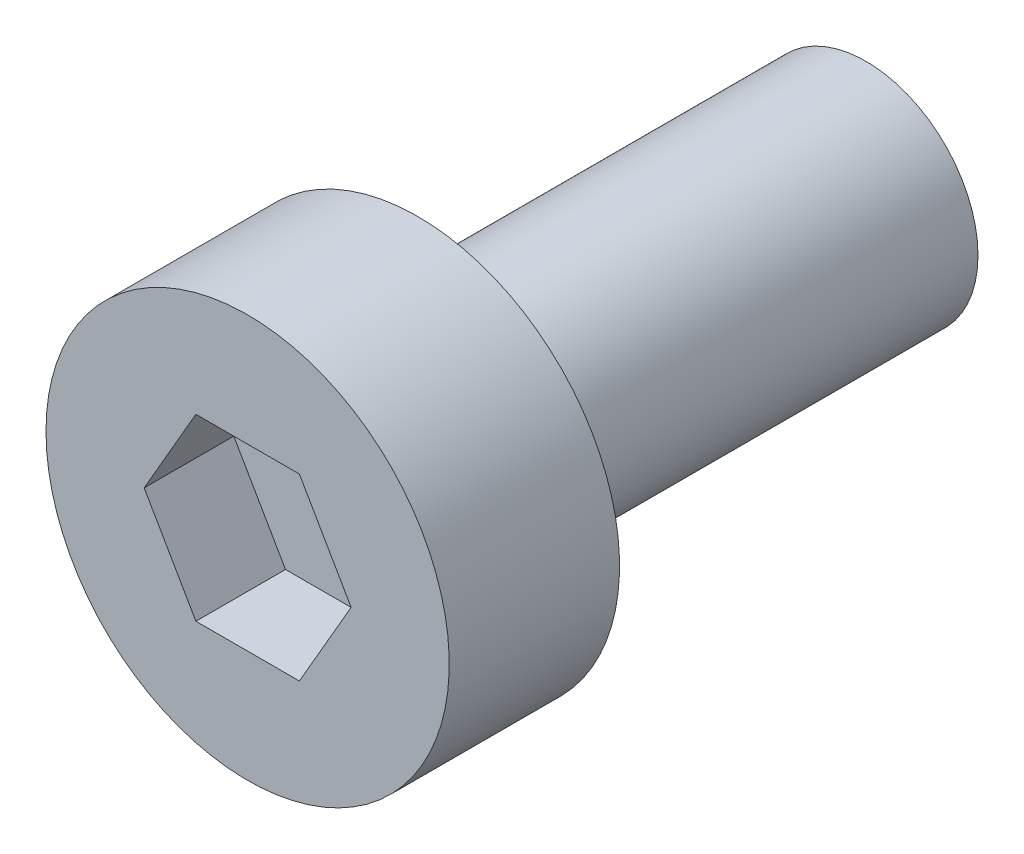
ISO-10303-21;
HEADER;
FILE_DESCRIPTION(('STEP AP214'),'2;1');
FILE_NAME('part.step','',(''),(''),'','','');
FILE_SCHEMA(('AUTOMOTIVE_DESIGN { 1 0 10303 214 1 1 1 1 }'));
ENDSEC;
DATA;
#1=APPLICATION_CONTEXT('core data for automotive mechanical design processes');
#2=APPLICATION_PROTOCOL_DEFINITION('international standard','automotive_design',2000,#1);
#3=PRODUCT_CONTEXT('',#1,'mechanical');
#4=PRODUCT('Part','Part','',(#3));
#5=PRODUCT_RELATED_PRODUCT_CATEGORY('part','',(#4));
#6=PRODUCT_DEFINITION_FORMATION('','',#4);
#7=PRODUCT_DEFINITION_CONTEXT('part definition',#1,'design');
#8=PRODUCT_DEFINITION('design','',#6,#7);
#9=PRODUCT_DEFINITION_SHAPE('','',#8);
#10=(LENGTH_UNIT() NAMED_UNIT(*) SI_UNIT(.MILLI.,.METRE.));
#11=(NAMED_UNIT(*) PLANE_ANGLE_UNIT() SI_UNIT($,.RADIAN.));
#12=(NAMED_UNIT(*) SI_UNIT($,.STERADIAN.) SOLID_ANGLE_UNIT());
#13=UNCERTAINTY_MEASURE_WITH_UNIT(LENGTH_MEASURE(1.E-05),#10,'distance_accuracy_value','');
#14=(GEOMETRIC_REPRESENTATION_CONTEXT(3) GLOBAL_UNCERTAINTY_ASSIGNED_CONTEXT((#13)) GLOBAL_UNIT_ASSIGNED_CONTEXT((#10,
#11,#12)) REPRESENTATION_CONTEXT('',''));
#15=CARTESIAN_POINT('',(0.,0.,0.));
#16=DIRECTION('',(0.,0.,1.));
#17=DIRECTION('',(1.,0.,0.));
#18=AXIS2_PLACEMENT_3D('',#15,#16,#17);
#19=CARTESIAN_POINT('',(0.,0.,5.));
#20=DIRECTION('',(0.,0.,-1.));
#21=DIRECTION('',(-1.,0.,0.));
#22=AXIS2_PLACEMENT_3D('',#19,#20,#21);
#23=CYLINDRICAL_SURFACE('',#22,1.25);
#24=CARTESIAN_POINT('',(0.,0.,5.));
#25=DIRECTION('',(0.,0.,1.));
#26=DIRECTION('',(1.,0.,0.));
#27=AXIS2_PLACEMENT_3D('',#24,#25,#26);
#28=CIRCLE('',#27,1.25);
#29=CARTESIAN_POINT('',(1.25,0.,5.));
#30=VERTEX_POINT('',#29);
#31=EDGE_CURVE('E11',#30,#30,#28,.T.);
#32=ORIENTED_EDGE('',*,*,#31,.F.);
#33=EDGE_LOOP('',(#32));
#34=FACE_BOUND('',#33,.T.);
#35=CARTESIAN_POINT('',(0.,0.,0.));
#36=DIRECTION('',(0.,0.,1.));
#37=DIRECTION('',(1.,0.,0.));
#38=AXIS2_PLACEMENT_3D('',#35,#36,#37);
#39=CIRCLE('',#38,1.25);
#40=CARTESIAN_POINT('',(1.25,0.,0.));
#41=VERTEX_POINT('',#40);
#42=EDGE_CURVE('E42',#41,#41,#39,.T.);
#43=ORIENTED_EDGE('',*,*,#42,.T.);
#44=EDGE_LOOP('',(#43));
#45=FACE_BOUND('',#44,.T.);
#46=ADVANCED_FACE('F39',(#34,#45),#23,.T.);
#47=CARTESIAN_POINT('',(0.,0.,0.));
#48=DIRECTION('',(0.,0.,1.));
#49=DIRECTION('',(1.,0.,0.));
#50=AXIS2_PLACEMENT_3D('',#47,#48,#49);
#51=PLANE('',#50);
#52=ORIENTED_EDGE('',*,*,#42,.F.);
#53=EDGE_LOOP('',(#52));
#54=FACE_BOUND('',#53,.T.);
#55=ADVANCED_FACE('F189',(#54),#51,.F.);
#56=CARTESIAN_POINT('',(0.,0.,6.9));
#57=DIRECTION('',(0.,0.,-1.));
#58=DIRECTION('',(-1.,0.,0.));
#59=AXIS2_PLACEMENT_3D('',#56,#57,#58);
#60=CYLINDRICAL_SURFACE('',#59,2.25);
#61=CARTESIAN_POINT('',(0.,0.,6.9));
#62=DIRECTION('',(0.,0.,1.));
#63=DIRECTION('',(1.,0.,0.));
#64=AXIS2_PLACEMENT_3D('',#61,#62,#63);
#65=CIRCLE('',#64,2.25);
#66=CARTESIAN_POINT('',(-2.25,0.,6.9));
#67=VERTEX_POINT('',#66);
#68=EDGE_CURVE('E163',#67,#67,#65,.T.);
#69=CARTESIAN_POINT('',(0.,0.,5.));
#70=DIRECTION('',(0.,0.,1.));
#71=DIRECTION('',(1.,0.,0.));
#72=AXIS2_PLACEMENT_3D('',#69,#70,#71);
#73=CIRCLE('',#72,2.25);
#74=CARTESIAN_POINT('',(-2.25,0.,5.));
#75=VERTEX_POINT('',#74);
#76=EDGE_CURVE('E153',#75,#75,#73,.T.);
#77=CARTESIAN_POINT('',(-2.25,0.,6.9));
#78=CARTESIAN_POINT('',(-2.25,0.,6.88020833333333));
#79=CARTESIAN_POINT('',(-2.25,0.,6.86041666666667));
#80=CARTESIAN_POINT('',(-2.25,0.,6.82083333333333));
#81=CARTESIAN_POINT('',(-2.25,0.,6.80104166666667));
#82=CARTESIAN_POINT('',(-2.25,0.,6.76145833333333));
#83=CARTESIAN_POINT('',(-2.25,0.,6.74166666666667));
#84=CARTESIAN_POINT('',(-2.25,0.,6.70208333333333));
#85=CARTESIAN_POINT('',(-2.25,0.,6.68229166666667));
#86=CARTESIAN_POINT('',(-2.25,0.,6.64270833333333));
#87=CARTESIAN_POINT('',(-2.25,0.,6.62291666666667));
#88=CARTESIAN_POINT('',(-2.25,0.,6.58333333333333));
#89=CARTESIAN_POINT('',(-2.25,0.,6.56354166666667));
#90=CARTESIAN_POINT('',(-2.25,0.,6.52395833333333));
#91=CARTESIAN_POINT('',(-2.25,0.,6.50416666666667));
#92=CARTESIAN_POINT('',(-2.25,0.,6.46458333333333));
#93=CARTESIAN_POINT('',(-2.25,0.,6.44479166666667));
#94=CARTESIAN_POINT('',(-2.25,0.,6.40520833333333));
#95=CARTESIAN_POINT('',(-2.25,0.,6.38541666666667));
#96=CARTESIAN_POINT('',(-2.25,0.,6.34583333333333));
#97=CARTESIAN_POINT('',(-2.25,0.,6.32604166666667));
#98=CARTESIAN_POINT('',(-2.25,0.,6.28645833333333));
#99=CARTESIAN_POINT('',(-2.25,0.,6.26666666666667));
#100=CARTESIAN_POINT('',(-2.25,0.,6.22708333333333));
#101=CARTESIAN_POINT('',(-2.25,0.,6.20729166666667));
#102=CARTESIAN_POINT('',(-2.25,0.,6.16770833333333));
#103=CARTESIAN_POINT('',(-2.25,0.,6.14791666666667));
#104=CARTESIAN_POINT('',(-2.25,0.,6.10833333333333));
#105=CARTESIAN_POINT('',(-2.25,0.,6.08854166666667));
#106=CARTESIAN_POINT('',(-2.25,0.,6.04895833333333));
#107=CARTESIAN_POINT('',(-2.25,0.,6.02916666666667));
#108=CARTESIAN_POINT('',(-2.25,0.,5.98958333333333));
#109=CARTESIAN_POINT('',(-2.25,0.,5.96979166666667));
#110=CARTESIAN_POINT('',(-2.25,0.,5.93020833333333));
#111=CARTESIAN_POINT('',(-2.25,0.,5.91041666666667));
#112=CARTESIAN_POINT('',(-2.25,0.,5.87083333333333));
#113=CARTESIAN_POINT('',(-2.25,0.,5.85104166666667));
#114=CARTESIAN_POINT('',(-2.25,0.,5.81145833333333));
#115=CARTESIAN_POINT('',(-2.25,0.,5.79166666666667));
#116=CARTESIAN_POINT('',(-2.25,0.,5.75208333333333));
#117=CARTESIAN_POINT('',(-2.25,0.,5.73229166666667));
#118=CARTESIAN_POINT('',(-2.25,0.,5.69270833333333));
#119=CARTESIAN_POINT('',(-2.25,0.,5.67291666666667));
#120=CARTESIAN_POINT('',(-2.25,0.,5.63333333333333));
#121=CARTESIAN_POINT('',(-2.25,0.,5.61354166666667));
#122=CARTESIAN_POINT('',(-2.25,0.,5.57395833333333));
#123=CARTESIAN_POINT('',(-2.25,0.,5.55416666666667));
#124=CARTESIAN_POINT('',(-2.25,0.,5.51458333333333));
#125=CARTESIAN_POINT('',(-2.25,0.,5.49479166666667));
#126=CARTESIAN_POINT('',(-2.25,0.,5.45520833333333));
#127=CARTESIAN_POINT('',(-2.25,0.,5.43541666666667));
#128=CARTESIAN_POINT('',(-2.25,0.,5.39583333333333));
#129=CARTESIAN_POINT('',(-2.25,0.,5.37604166666667));
#130=CARTESIAN_POINT('',(-2.25,0.,5.33645833333333));
#131=CARTESIAN_POINT('',(-2.25,0.,5.31666666666667));
#132=CARTESIAN_POINT('',(-2.25,0.,5.27708333333333));
#133=CARTESIAN_POINT('',(-2.25,0.,5.25729166666667));
#134=CARTESIAN_POINT('',(-2.25,0.,5.21770833333333));
#135=CARTESIAN_POINT('',(-2.25,0.,5.19791666666667));
#136=CARTESIAN_POINT('',(-2.25,0.,5.15833333333333));
#137=CARTESIAN_POINT('',(-2.25,0.,5.13854166666667));
#138=CARTESIAN_POINT('',(-2.25,0.,5.09895833333333));
#139=CARTESIAN_POINT('',(-2.25,0.,5.07916666666667));
#140=CARTESIAN_POINT('',(-2.25,0.,5.03958333333333));
#141=CARTESIAN_POINT('',(-2.25,0.,5.01979166666667));
#142=CARTESIAN_POINT('',(-2.25,0.,5.));
#143=B_SPLINE_CURVE_WITH_KNOTS('',3,(#77,#78,#79,#80,#81,#82,#83,#84,#85,#86,#87,#88,#89,#90,
#91,#92,#93,#94,#95,#96,#97,#98,#99,#100,#101,#102,#103,#104,#105,#106,#107,#108,#109,#110,#111,
#112,#113,#114,#115,#116,#117,#118,#119,#120,#121,#122,#123,#124,#125,#126,#127,#128,#129,#130,
#131,#132,#133,#134,#135,#136,#137,#138,#139,#140,#141,#142),.UNSPECIFIED.,.F.,.F.,(4,2,2,2,2,2,
2,2,2,2,2,2,2,2,2,2,2,2,2,2,2,2,2,2,2,2,2,2,2,2,2,2,4),(0.,0.0593750000000004,0.118750000000001,
0.178125,0.237500000000001,0.296875,0.356250000000001,0.415625,0.475000000000001,0.534375,
0.593750000000001,0.653125,0.7125,0.771875,0.83125,0.890625,0.95,1.009375,1.06875,1.128125,
1.1875,1.246875,1.30625,1.365625,1.425,1.484375,1.54375,1.603125,1.6625,1.721875,1.78125,
1.840625,1.9),.UNSPECIFIED.);
#144=EDGE_CURVE('BSEAM171',#67,#75,#143,.T.);
#145=ORIENTED_EDGE('',*,*,#68,.F.);
#146=ORIENTED_EDGE('',*,*,#76,.T.);
#147=ORIENTED_EDGE('',*,*,#144,.T.);
#148=ORIENTED_EDGE('',*,*,#144,.F.);
#149=EDGE_LOOP('',(#145,#147,#146,#148));
#150=FACE_BOUND('',#149,.T.);
#151=ADVANCED_FACE('F171',(#150),#60,.T.);
#152=CARTESIAN_POINT('',(0.,0.,6.9));
#153=DIRECTION('',(0.,0.,1.));
#154=DIRECTION('',(1.,0.,0.));
#155=AXIS2_PLACEMENT_3D('',#152,#153,#154);
#156=PLANE('',#155);
#157=DIRECTION('',(0.5,0.866025403784439,0.));
#158=VECTOR('',#157,1.);
#159=CARTESIAN_POINT('',(0.577350269189626,-1.,6.9));
#160=LINE('',#159,#158);
#161=CARTESIAN_POINT('',(0.577350269189626,-1.,6.9));
#162=VERTEX_POINT('',#161);
#163=CARTESIAN_POINT('',(1.15470053837925,0.,6.9));
#164=VERTEX_POINT('',#163);
#165=EDGE_CURVE('E54',#162,#164,#160,.T.);
#166=ORIENTED_EDGE('',*,*,#165,.F.);
#167=DIRECTION('',(1.,0.,0.));
#168=VECTOR('',#167,1.);
#169=CARTESIAN_POINT('',(-0.577350269189626,-1.,6.9));
#170=LINE('',#169,#168);
#171=CARTESIAN_POINT('',(-0.577350269189626,-1.,6.9));
#172=VERTEX_POINT('',#171);
#173=EDGE_CURVE('E147',#172,#162,#170,.T.);
#174=ORIENTED_EDGE('',*,*,#173,.F.);
#175=DIRECTION('',(0.5,-0.866025403784439,0.));
#176=VECTOR('',#175,1.);
#177=CARTESIAN_POINT('',(-1.15470053837925,0.,6.9));
#178=LINE('',#177,#176);
#179=CARTESIAN_POINT('',(-1.15470053837925,0.,6.9));
#180=VERTEX_POINT('',#179);
#181=EDGE_CURVE('E144',#180,#172,#178,.T.);
#182=ORIENTED_EDGE('',*,*,#181,.F.);
#183=DIRECTION('',(-0.5,-0.866025403784439,0.));
#184=VECTOR('',#183,1.);
#185=CARTESIAN_POINT('',(-0.577350269189626,1.,6.9));
#186=LINE('',#185,#184);
#187=CARTESIAN_POINT('',(-0.577350269189626,1.,6.9));
#188=VERTEX_POINT('',#187);
#189=EDGE_CURVE('E102',#188,#180,#186,.T.);
#190=ORIENTED_EDGE('',*,*,#189,.F.);
#191=DIRECTION('',(-1.,0.,0.));
#192=VECTOR('',#191,1.);
#193=CARTESIAN_POINT('',(0.577350269189626,1.,6.9));
#194=LINE('',#193,#192);
#195=CARTESIAN_POINT('',(0.577350269189626,1.,6.9));
#196=VERTEX_POINT('',#195);
#197=EDGE_CURVE('E138',#196,#188,#194,.T.);
#198=ORIENTED_EDGE('',*,*,#197,.F.);
#199=DIRECTION('',(-0.5,0.866025403784438,0.));
#200=VECTOR('',#199,1.);
#201=CARTESIAN_POINT('',(1.15470053837925,0.,6.9));
#202=LINE('',#201,#200);
#203=EDGE_CURVE('E134',#164,#196,#202,.T.);
#204=ORIENTED_EDGE('',*,*,#203,.F.);
#205=EDGE_LOOP('',(#166,#174,#182,#190,#198,#204));
#206=FACE_BOUND('',#205,.T.);
#207=ORIENTED_EDGE('',*,*,#68,.T.);
#208=EDGE_LOOP('',(#207));
#209=FACE_BOUND('',#208,.T.);
#210=ADVANCED_FACE('F176',(#206,#209),#156,.T.);
#211=CARTESIAN_POINT('',(0.,0.,5.));
#212=DIRECTION('',(0.,0.,1.));
#213=DIRECTION('',(1.,0.,0.));
#214=AXIS2_PLACEMENT_3D('',#211,#212,#213);
#215=PLANE('',#214);
#216=ORIENTED_EDGE('',*,*,#31,.T.);
#217=EDGE_LOOP('',(#216));
#218=FACE_BOUND('',#217,.T.);
#219=ORIENTED_EDGE('',*,*,#76,.F.);
#220=EDGE_LOOP('',(#219));
#221=FACE_BOUND('',#220,.T.);
#222=ADVANCED_FACE('F173',(#218,#221),#215,.F.);
#223=CARTESIAN_POINT('',(0.577350269189626,-1.,5.9));
#224=DIRECTION('',(0.866025403784439,-0.5,0.));
#225=DIRECTION('',(0.5,0.866025403784439,0.));
#226=AXIS2_PLACEMENT_3D('',#223,#224,#225);
#227=PLANE('',#226);
#228=ORIENTED_EDGE('',*,*,#165,.T.);
#229=DIRECTION('',(0.,0.,1.));
#230=VECTOR('',#229,1.);
#231=CARTESIAN_POINT('',(1.15470053837925,0.,5.9));
#232=LINE('',#231,#230);
#233=CARTESIAN_POINT('',(1.15470053837925,0.,5.9));
#234=VERTEX_POINT('',#233);
#235=EDGE_CURVE('E84',#234,#164,#232,.T.);
#236=ORIENTED_EDGE('',*,*,#235,.F.);
#237=DIRECTION('',(0.5,0.866025403784439,0.));
#238=VECTOR('',#237,1.);
#239=CARTESIAN_POINT('',(0.577350269189626,-1.,5.9));
#240=LINE('',#239,#238);
#241=CARTESIAN_POINT('',(0.577350269189626,-1.,5.9));
#242=VERTEX_POINT('',#241);
#243=EDGE_CURVE('E150',#242,#234,#240,.T.);
#244=ORIENTED_EDGE('',*,*,#243,.F.);
#245=DIRECTION('',(0.,0.,1.));
#246=VECTOR('',#245,1.);
#247=CARTESIAN_POINT('',(0.577350269189626,-1.,5.9));
#248=LINE('',#247,#246);
#249=EDGE_CURVE('E62',#242,#162,#248,.T.);
#250=ORIENTED_EDGE('',*,*,#249,.T.);
#251=EDGE_LOOP('',(#228,#236,#244,#250));
#252=FACE_BOUND('',#251,.T.);
#253=ADVANCED_FACE('F175',(#252),#227,.F.);
#254=CARTESIAN_POINT('',(-0.577350269189626,-1.,5.9));
#255=DIRECTION('',(0.,-1.,0.));
#256=DIRECTION('',(0.,0.,-1.));
#257=AXIS2_PLACEMENT_3D('',#254,#255,#256);
#258=PLANE('',#257);
#259=ORIENTED_EDGE('',*,*,#173,.T.);
#260=ORIENTED_EDGE('',*,*,#249,.F.);
#261=DIRECTION('',(1.,0.,0.));
#262=VECTOR('',#261,1.);
#263=CARTESIAN_POINT('',(-0.577350269189626,-1.,5.9));
#264=LINE('',#263,#262);
#265=CARTESIAN_POINT('',(-0.577350269189626,-1.,5.9));
#266=VERTEX_POINT('',#265);
#267=EDGE_CURVE('E116',#266,#242,#264,.T.);
#268=ORIENTED_EDGE('',*,*,#267,.F.);
#269=DIRECTION('',(0.,0.,1.));
#270=VECTOR('',#269,1.);
#271=CARTESIAN_POINT('',(-0.577350269189626,-1.,5.9));
#272=LINE('',#271,#270);
#273=EDGE_CURVE('E107',#266,#172,#272,.T.);
#274=ORIENTED_EDGE('',*,*,#273,.T.);
#275=EDGE_LOOP('',(#259,#260,#268,#274));
#276=FACE_BOUND('',#275,.T.);
#277=ADVANCED_FACE('F183',(#276),#258,.F.);
#278=CARTESIAN_POINT('',(-1.15470053837925,0.,5.9));
#279=DIRECTION('',(-0.866025403784439,-0.5,0.));
#280=DIRECTION('',(0.5,-0.866025403784439,0.));
#281=AXIS2_PLACEMENT_3D('',#278,#279,#280);
#282=PLANE('',#281);
#283=ORIENTED_EDGE('',*,*,#181,.T.);
#284=ORIENTED_EDGE('',*,*,#273,.F.);
#285=DIRECTION('',(0.5,-0.866025403784439,0.));
#286=VECTOR('',#285,1.);
#287=CARTESIAN_POINT('',(-1.15470053837925,0.,5.9));
#288=LINE('',#287,#286);
#289=CARTESIAN_POINT('',(-1.15470053837925,0.,5.9));
#290=VERTEX_POINT('',#289);
#291=EDGE_CURVE('E111',#290,#266,#288,.T.);
#292=ORIENTED_EDGE('',*,*,#291,.F.);
#293=DIRECTION('',(0.,0.,1.));
#294=VECTOR('',#293,1.);
#295=CARTESIAN_POINT('',(-1.15470053837925,0.,5.9));
#296=LINE('',#295,#294);
#297=EDGE_CURVE('E95',#290,#180,#296,.T.);
#298=ORIENTED_EDGE('',*,*,#297,.T.);
#299=EDGE_LOOP('',(#283,#284,#292,#298));
#300=FACE_BOUND('',#299,.T.);
#301=ADVANCED_FACE('F112',(#300),#282,.F.);
#302=CARTESIAN_POINT('',(-0.577350269189626,1.,5.9));
#303=DIRECTION('',(-0.866025403784439,0.5,0.));
#304=DIRECTION('',(-0.5,-0.866025403784439,0.));
#305=AXIS2_PLACEMENT_3D('',#302,#303,#304);
#306=PLANE('',#305);
#307=ORIENTED_EDGE('',*,*,#189,.T.);
#308=ORIENTED_EDGE('',*,*,#297,.F.);
#309=DIRECTION('',(-0.5,-0.866025403784439,0.));
#310=VECTOR('',#309,1.);
#311=CARTESIAN_POINT('',(-0.577350269189626,1.,5.9));
#312=LINE('',#311,#310);
#313=CARTESIAN_POINT('',(-0.577350269189626,1.,5.9));
#314=VERTEX_POINT('',#313);
#315=EDGE_CURVE('E99',#314,#290,#312,.T.);
#316=ORIENTED_EDGE('',*,*,#315,.F.);
#317=DIRECTION('',(0.,0.,1.));
#318=VECTOR('',#317,1.);
#319=CARTESIAN_POINT('',(-0.577350269189626,1.,5.9));
#320=LINE('',#319,#318);
#321=EDGE_CURVE('E108',#314,#188,#320,.T.);
#322=ORIENTED_EDGE('',*,*,#321,.T.);
#323=EDGE_LOOP('',(#307,#308,#316,#322));
#324=FACE_BOUND('',#323,.T.);
#325=ADVANCED_FACE('F97',(#324),#306,.F.);
#326=CARTESIAN_POINT('',(0.577350269189626,1.,5.9));
#327=DIRECTION('',(0.,1.,0.));
#328=DIRECTION('',(0.,0.,1.));
#329=AXIS2_PLACEMENT_3D('',#326,#327,#328);
#330=PLANE('',#329);
#331=ORIENTED_EDGE('',*,*,#197,.T.);
#332=ORIENTED_EDGE('',*,*,#321,.F.);
#333=DIRECTION('',(-1.,0.,0.));
#334=VECTOR('',#333,1.);
#335=CARTESIAN_POINT('',(0.577350269189626,1.,5.9));
#336=LINE('',#335,#334);
#337=CARTESIAN_POINT('',(0.577350269189626,1.,5.9));
#338=VERTEX_POINT('',#337);
#339=EDGE_CURVE('E122',#338,#314,#336,.T.);
#340=ORIENTED_EDGE('',*,*,#339,.F.);
#341=DIRECTION('',(0.,0.,1.));
#342=VECTOR('',#341,1.);
#343=CARTESIAN_POINT('',(0.577350269189626,1.,5.9));
#344=LINE('',#343,#342);
#345=EDGE_CURVE('E158',#338,#196,#344,.T.);
#346=ORIENTED_EDGE('',*,*,#345,.T.);
#347=EDGE_LOOP('',(#331,#332,#340,#346));
#348=FACE_BOUND('',#347,.T.);
#349=ADVANCED_FACE('F245',(#348),#330,.F.);
#350=CARTESIAN_POINT('',(1.15470053837925,0.,5.9));
#351=DIRECTION('',(0.866025403784439,0.5,0.));
#352=DIRECTION('',(-0.5,0.866025403784438,0.));
#353=AXIS2_PLACEMENT_3D('',#350,#351,#352);
#354=PLANE('',#353);
#355=ORIENTED_EDGE('',*,*,#203,.T.);
#356=ORIENTED_EDGE('',*,*,#345,.F.);
#357=DIRECTION('',(-0.5,0.866025403784438,0.));
#358=VECTOR('',#357,1.);
#359=CARTESIAN_POINT('',(1.15470053837925,0.,5.9));
#360=LINE('',#359,#358);
#361=EDGE_CURVE('E126',#234,#338,#360,.T.);
#362=ORIENTED_EDGE('',*,*,#361,.F.);
#363=ORIENTED_EDGE('',*,*,#235,.T.);
#364=EDGE_LOOP('',(#355,#356,#362,#363));
#365=FACE_BOUND('',#364,.T.);
#366=ADVANCED_FACE('F254',(#365),#354,.F.);
#367=CARTESIAN_POINT('',(0.,0.,5.9));
#368=DIRECTION('',(0.,0.,1.));
#369=DIRECTION('',(1.,0.,0.));
#370=AXIS2_PLACEMENT_3D('',#367,#368,#369);
#371=PLANE('',#370);
#372=ORIENTED_EDGE('',*,*,#243,.T.);
#373=ORIENTED_EDGE('',*,*,#361,.T.);
#374=ORIENTED_EDGE('',*,*,#339,.T.);
#375=ORIENTED_EDGE('',*,*,#315,.T.);
#376=ORIENTED_EDGE('',*,*,#291,.T.);
#377=ORIENTED_EDGE('',*,*,#267,.T.);
#378=EDGE_LOOP('',(#372,#373,#374,#375,#376,#377));
#379=FACE_BOUND('',#378,.T.);
#380=ADVANCED_FACE('F119',(#379),#371,.T.);
#381=CLOSED_SHELL('',(#46,#55,#151,#210,#222,#253,#277,#301,#325,#349,#366,#380));
#382=MANIFOLD_SOLID_BREP('B2',#381);
#383=ADVANCED_BREP_SHAPE_REPRESENTATION('',(#18,#382),#14);
#384=SHAPE_DEFINITION_REPRESENTATION(#9,#383);
ENDSEC;
END-ISO-10303-21;
